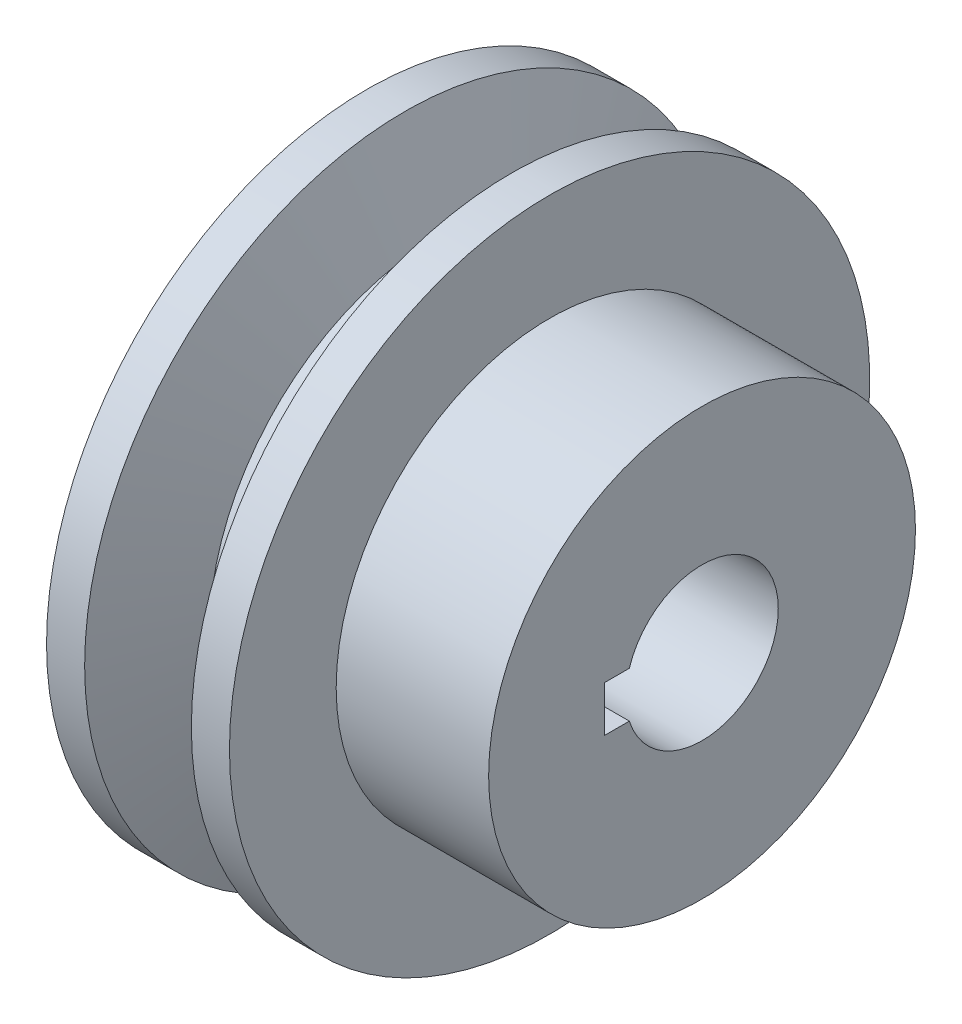
ISO-10303-21;
HEADER;
FILE_DESCRIPTION(('STEP AP214'),'2;1');
FILE_NAME('part.step','',(''),(''),'','','');
FILE_SCHEMA(('AUTOMOTIVE_DESIGN { 1 0 10303 214 1 1 1 1 }'));
ENDSEC;
DATA;
#1=APPLICATION_CONTEXT('core data for automotive mechanical design processes');
#2=APPLICATION_PROTOCOL_DEFINITION('international standard','automotive_design',2000,#1);
#3=PRODUCT_CONTEXT('',#1,'mechanical');
#4=PRODUCT('Part','Part','',(#3));
#5=PRODUCT_RELATED_PRODUCT_CATEGORY('part','',(#4));
#6=PRODUCT_DEFINITION_FORMATION('','',#4);
#7=PRODUCT_DEFINITION_CONTEXT('part definition',#1,'design');
#8=PRODUCT_DEFINITION('design','',#6,#7);
#9=PRODUCT_DEFINITION_SHAPE('','',#8);
#10=(LENGTH_UNIT() NAMED_UNIT(*) SI_UNIT(.MILLI.,.METRE.));
#11=(NAMED_UNIT(*) PLANE_ANGLE_UNIT() SI_UNIT($,.RADIAN.));
#12=(NAMED_UNIT(*) SI_UNIT($,.STERADIAN.) SOLID_ANGLE_UNIT());
#13=UNCERTAINTY_MEASURE_WITH_UNIT(LENGTH_MEASURE(1.E-05),#10,'distance_accuracy_value','');
#14=(GEOMETRIC_REPRESENTATION_CONTEXT(3) GLOBAL_UNCERTAINTY_ASSIGNED_CONTEXT((#13)) GLOBAL_UNIT_ASSIGNED_CONTEXT((#10,
#11,#12)) REPRESENTATION_CONTEXT('',''));
#15=CARTESIAN_POINT('',(0.,0.,0.));
#16=DIRECTION('',(0.,0.,1.));
#17=DIRECTION('',(1.,0.,0.));
#18=AXIS2_PLACEMENT_3D('',#15,#16,#17);
#19=CARTESIAN_POINT('',(0.,0.,0.));
#20=DIRECTION('',(1.,0.,0.));
#21=DIRECTION('',(0.,0.,-1.));
#22=AXIS2_PLACEMENT_3D('',#19,#20,#21);
#23=PLANE('',#22);
#24=DIRECTION('',(0.,0.,1.));
#25=VECTOR('',#24,1.);
#26=CARTESIAN_POINT('',(0.,-1.5,6.4));
#27=LINE('',#26,#25);
#28=CARTESIAN_POINT('',(0.,-1.5,4.76969600708473));
#29=VERTEX_POINT('',#28);
#30=CARTESIAN_POINT('',(0.,-1.5,6.4));
#31=VERTEX_POINT('',#30);
#32=EDGE_CURVE('E99',#29,#31,#27,.T.);
#33=ORIENTED_EDGE('',*,*,#32,.F.);
#34=CARTESIAN_POINT('',(0.,0.,0.));
#35=DIRECTION('',(-1.,0.,0.));
#36=DIRECTION('',(0.,0.,1.));
#37=AXIS2_PLACEMENT_3D('',#34,#35,#36);
#38=CIRCLE('',#37,5.);
#39=CARTESIAN_POINT('',(0.,1.5,4.76969600708473));
#40=VERTEX_POINT('',#39);
#41=EDGE_CURVE('E46',#40,#29,#38,.T.);
#42=ORIENTED_EDGE('',*,*,#41,.F.);
#43=DIRECTION('',(0.,0.,-1.));
#44=VECTOR('',#43,1.);
#45=CARTESIAN_POINT('',(0.,1.5,4.76969600708473));
#46=LINE('',#45,#44);
#47=CARTESIAN_POINT('',(0.,1.5,6.4));
#48=VERTEX_POINT('',#47);
#49=EDGE_CURVE('E90',#48,#40,#46,.T.);
#50=ORIENTED_EDGE('',*,*,#49,.F.);
#51=DIRECTION('',(0.,1.,0.));
#52=VECTOR('',#51,1.);
#53=CARTESIAN_POINT('',(0.,1.5,6.4));
#54=LINE('',#53,#52);
#55=EDGE_CURVE('E93',#31,#48,#54,.T.);
#56=ORIENTED_EDGE('',*,*,#55,.F.);
#57=EDGE_LOOP('',(#33,#42,#50,#56));
#58=FACE_BOUND('',#57,.T.);
#59=CARTESIAN_POINT('',(0.,0.,0.));
#60=DIRECTION('',(-1.,0.,0.));
#61=DIRECTION('',(0.,0.,1.));
#62=AXIS2_PLACEMENT_3D('',#59,#60,#61);
#63=CIRCLE('',#62,21.);
#64=CARTESIAN_POINT('',(0.,0.,21.));
#65=VERTEX_POINT('',#64);
#66=EDGE_CURVE('E11',#65,#65,#63,.T.);
#67=ORIENTED_EDGE('',*,*,#66,.T.);
#68=EDGE_LOOP('',(#67));
#69=FACE_BOUND('',#68,.T.);
#70=ADVANCED_FACE('F32',(#58,#69),#23,.F.);
#71=CARTESIAN_POINT('',(0.,0.,0.));
#72=DIRECTION('',(-1.,0.,0.));
#73=DIRECTION('',(0.,0.,1.));
#74=AXIS2_PLACEMENT_3D('',#71,#72,#73);
#75=CYLINDRICAL_SURFACE('',#74,21.);
#76=ORIENTED_EDGE('',*,*,#66,.F.);
#77=EDGE_LOOP('',(#76));
#78=FACE_BOUND('',#77,.T.);
#79=CARTESIAN_POINT('',(2.5,0.,0.));
#80=DIRECTION('',(-1.,0.,0.));
#81=DIRECTION('',(0.,0.,1.));
#82=AXIS2_PLACEMENT_3D('',#79,#80,#81);
#83=CIRCLE('',#82,21.);
#84=CARTESIAN_POINT('',(2.5,0.,21.));
#85=VERTEX_POINT('',#84);
#86=EDGE_CURVE('E39',#85,#85,#83,.T.);
#87=ORIENTED_EDGE('',*,*,#86,.T.);
#88=EDGE_LOOP('',(#87));
#89=FACE_BOUND('',#88,.T.);
#90=ADVANCED_FACE('F128',(#78,#89),#75,.T.);
#91=CARTESIAN_POINT('',(4.68382140559719,0.,0.));
#92=DIRECTION('',(-1.,0.,0.));
#93=DIRECTION('',(0.,0.,1.));
#94=AXIS2_PLACEMENT_3D('',#91,#92,#93);
#95=CONICAL_SURFACE('',#94,15.,1.22173047639603);
#96=ORIENTED_EDGE('',*,*,#86,.F.);
#97=EDGE_LOOP('',(#96));
#98=FACE_BOUND('',#97,.T.);
#99=CARTESIAN_POINT('',(4.68382140559719,0.,0.));
#100=DIRECTION('',(-1.,0.,0.));
#101=DIRECTION('',(0.,0.,1.));
#102=AXIS2_PLACEMENT_3D('',#99,#100,#101);
#103=CIRCLE('',#102,15.);
#104=CARTESIAN_POINT('',(4.68382140559719,0.,15.));
#105=VERTEX_POINT('',#104);
#106=EDGE_CURVE('E123',#105,#105,#103,.T.);
#107=ORIENTED_EDGE('',*,*,#106,.T.);
#108=EDGE_LOOP('',(#107));
#109=FACE_BOUND('',#108,.T.);
#110=ADVANCED_FACE('F130',(#98,#109),#95,.T.);
#111=CARTESIAN_POINT('',(0.,0.,0.));
#112=DIRECTION('',(-1.,0.,0.));
#113=DIRECTION('',(0.,0.,1.));
#114=AXIS2_PLACEMENT_3D('',#111,#112,#113);
#115=CYLINDRICAL_SURFACE('',#114,15.);
#116=ORIENTED_EDGE('',*,*,#106,.F.);
#117=EDGE_LOOP('',(#116));
#118=FACE_BOUND('',#117,.T.);
#119=CARTESIAN_POINT('',(7.31617859440281,0.,0.));
#120=DIRECTION('',(-1.,0.,0.));
#121=DIRECTION('',(0.,0.,1.));
#122=AXIS2_PLACEMENT_3D('',#119,#120,#121);
#123=CIRCLE('',#122,15.);
#124=CARTESIAN_POINT('',(7.31617859440281,0.,15.));
#125=VERTEX_POINT('',#124);
#126=EDGE_CURVE('E120',#125,#125,#123,.T.);
#127=ORIENTED_EDGE('',*,*,#126,.T.);
#128=EDGE_LOOP('',(#127));
#129=FACE_BOUND('',#128,.T.);
#130=ADVANCED_FACE('F133',(#118,#129),#115,.T.);
#131=CARTESIAN_POINT('',(9.5,0.,0.));
#132=DIRECTION('',(1.,0.,0.));
#133=DIRECTION('',(0.,0.,-1.));
#134=AXIS2_PLACEMENT_3D('',#131,#132,#133);
#135=CONICAL_SURFACE('',#134,21.,1.22173047639603);
#136=ORIENTED_EDGE('',*,*,#126,.F.);
#137=EDGE_LOOP('',(#136));
#138=FACE_BOUND('',#137,.T.);
#139=CARTESIAN_POINT('',(9.5,0.,0.));
#140=DIRECTION('',(-1.,0.,0.));
#141=DIRECTION('',(0.,0.,1.));
#142=AXIS2_PLACEMENT_3D('',#139,#140,#141);
#143=CIRCLE('',#142,21.);
#144=CARTESIAN_POINT('',(9.5,0.,21.));
#145=VERTEX_POINT('',#144);
#146=EDGE_CURVE('E117',#145,#145,#143,.T.);
#147=ORIENTED_EDGE('',*,*,#146,.T.);
#148=EDGE_LOOP('',(#147));
#149=FACE_BOUND('',#148,.T.);
#150=ADVANCED_FACE('F139',(#138,#149),#135,.T.);
#151=CARTESIAN_POINT('',(0.,0.,0.));
#152=DIRECTION('',(-1.,0.,0.));
#153=DIRECTION('',(0.,0.,1.));
#154=AXIS2_PLACEMENT_3D('',#151,#152,#153);
#155=CYLINDRICAL_SURFACE('',#154,21.);
#156=ORIENTED_EDGE('',*,*,#146,.F.);
#157=EDGE_LOOP('',(#156));
#158=FACE_BOUND('',#157,.T.);
#159=CARTESIAN_POINT('',(12.,0.,0.));
#160=DIRECTION('',(-1.,0.,0.));
#161=DIRECTION('',(0.,0.,1.));
#162=AXIS2_PLACEMENT_3D('',#159,#160,#161);
#163=CIRCLE('',#162,21.);
#164=CARTESIAN_POINT('',(12.,0.,21.));
#165=VERTEX_POINT('',#164);
#166=EDGE_CURVE('E114',#165,#165,#163,.T.);
#167=ORIENTED_EDGE('',*,*,#166,.T.);
#168=EDGE_LOOP('',(#167));
#169=FACE_BOUND('',#168,.T.);
#170=ADVANCED_FACE('F145',(#158,#169),#155,.T.);
#171=CARTESIAN_POINT('',(12.,21.,0.));
#172=DIRECTION('',(-1.,0.,0.));
#173=DIRECTION('',(0.,0.,1.));
#174=AXIS2_PLACEMENT_3D('',#171,#172,#173);
#175=PLANE('',#174);
#176=ORIENTED_EDGE('',*,*,#166,.F.);
#177=EDGE_LOOP('',(#176));
#178=FACE_BOUND('',#177,.T.);
#179=CARTESIAN_POINT('',(12.,0.,0.));
#180=DIRECTION('',(-1.,0.,0.));
#181=DIRECTION('',(0.,0.,1.));
#182=AXIS2_PLACEMENT_3D('',#179,#180,#181);
#183=CIRCLE('',#182,14.);
#184=CARTESIAN_POINT('',(12.,0.,14.));
#185=VERTEX_POINT('',#184);
#186=EDGE_CURVE('E111',#185,#185,#183,.T.);
#187=ORIENTED_EDGE('',*,*,#186,.T.);
#188=EDGE_LOOP('',(#187));
#189=FACE_BOUND('',#188,.T.);
#190=ADVANCED_FACE('F151',(#178,#189),#175,.F.);
#191=CARTESIAN_POINT('',(0.,0.,0.));
#192=DIRECTION('',(-1.,0.,0.));
#193=DIRECTION('',(0.,0.,1.));
#194=AXIS2_PLACEMENT_3D('',#191,#192,#193);
#195=CYLINDRICAL_SURFACE('',#194,14.);
#196=ORIENTED_EDGE('',*,*,#186,.F.);
#197=EDGE_LOOP('',(#196));
#198=FACE_BOUND('',#197,.T.);
#199=CARTESIAN_POINT('',(22.,0.,0.));
#200=DIRECTION('',(-1.,0.,0.));
#201=DIRECTION('',(0.,0.,1.));
#202=AXIS2_PLACEMENT_3D('',#199,#200,#201);
#203=CIRCLE('',#202,14.);
#204=CARTESIAN_POINT('',(22.,0.,14.));
#205=VERTEX_POINT('',#204);
#206=EDGE_CURVE('E105',#205,#205,#203,.T.);
#207=ORIENTED_EDGE('',*,*,#206,.T.);
#208=EDGE_LOOP('',(#207));
#209=FACE_BOUND('',#208,.T.);
#210=ADVANCED_FACE('F157',(#198,#209),#195,.T.);
#211=CARTESIAN_POINT('',(22.,14.,0.));
#212=DIRECTION('',(-1.,0.,0.));
#213=DIRECTION('',(0.,0.,1.));
#214=AXIS2_PLACEMENT_3D('',#211,#212,#213);
#215=PLANE('',#214);
#216=DIRECTION('',(0.,0.,-1.));
#217=VECTOR('',#216,1.);
#218=CARTESIAN_POINT('',(22.,1.5,4.76969600708473));
#219=LINE('',#218,#217);
#220=CARTESIAN_POINT('',(22.,1.5,6.4));
#221=VERTEX_POINT('',#220);
#222=CARTESIAN_POINT('',(22.,1.5,4.76969600708473));
#223=VERTEX_POINT('',#222);
#224=EDGE_CURVE('E80',#221,#223,#219,.T.);
#225=ORIENTED_EDGE('',*,*,#224,.T.);
#226=CARTESIAN_POINT('',(22.,0.,0.));
#227=DIRECTION('',(-1.,0.,0.));
#228=DIRECTION('',(0.,0.,1.));
#229=AXIS2_PLACEMENT_3D('',#226,#227,#228);
#230=CIRCLE('',#229,5.);
#231=CARTESIAN_POINT('',(22.,-1.5,4.76969600708473));
#232=VERTEX_POINT('',#231);
#233=EDGE_CURVE('E74',#223,#232,#230,.T.);
#234=ORIENTED_EDGE('',*,*,#233,.T.);
#235=DIRECTION('',(0.,0.,1.));
#236=VECTOR('',#235,1.);
#237=CARTESIAN_POINT('',(22.,-1.5,6.4));
#238=LINE('',#237,#236);
#239=CARTESIAN_POINT('',(22.,-1.5,6.4));
#240=VERTEX_POINT('',#239);
#241=EDGE_CURVE('E83',#232,#240,#238,.T.);
#242=ORIENTED_EDGE('',*,*,#241,.T.);
#243=DIRECTION('',(0.,1.,0.));
#244=VECTOR('',#243,1.);
#245=CARTESIAN_POINT('',(22.,1.5,6.4));
#246=LINE('',#245,#244);
#247=EDGE_CURVE('E54',#240,#221,#246,.T.);
#248=ORIENTED_EDGE('',*,*,#247,.T.);
#249=EDGE_LOOP('',(#225,#234,#242,#248));
#250=FACE_BOUND('',#249,.T.);
#251=ORIENTED_EDGE('',*,*,#206,.F.);
#252=EDGE_LOOP('',(#251));
#253=FACE_BOUND('',#252,.T.);
#254=ADVANCED_FACE('F87',(#250,#253),#215,.F.);
#255=CARTESIAN_POINT('',(22.,0.,0.));
#256=DIRECTION('',(-1.,0.,0.));
#257=DIRECTION('',(0.,0.,1.));
#258=AXIS2_PLACEMENT_3D('',#255,#256,#257);
#259=CYLINDRICAL_SURFACE('',#258,5.);
#260=ORIENTED_EDGE('',*,*,#41,.T.);
#261=DIRECTION('',(-1.,0.,0.));
#262=VECTOR('',#261,1.);
#263=CARTESIAN_POINT('',(22.,-1.5,4.76969600708473));
#264=LINE('',#263,#262);
#265=EDGE_CURVE('E70',#232,#29,#264,.T.);
#266=ORIENTED_EDGE('',*,*,#265,.F.);
#267=ORIENTED_EDGE('',*,*,#233,.F.);
#268=DIRECTION('',(-1.,0.,0.));
#269=VECTOR('',#268,1.);
#270=CARTESIAN_POINT('',(22.,1.5,4.76969600708473));
#271=LINE('',#270,#269);
#272=EDGE_CURVE('E103',#223,#40,#271,.T.);
#273=ORIENTED_EDGE('',*,*,#272,.T.);
#274=EDGE_LOOP('',(#260,#266,#267,#273));
#275=FACE_BOUND('',#274,.T.);
#276=ADVANCED_FACE('F72',(#275),#259,.F.);
#277=CARTESIAN_POINT('',(22.,1.5,4.76969600708473));
#278=DIRECTION('',(0.,1.,0.));
#279=DIRECTION('',(0.,0.,1.));
#280=AXIS2_PLACEMENT_3D('',#277,#278,#279);
#281=PLANE('',#280);
#282=ORIENTED_EDGE('',*,*,#49,.T.);
#283=ORIENTED_EDGE('',*,*,#272,.F.);
#284=ORIENTED_EDGE('',*,*,#224,.F.);
#285=DIRECTION('',(-1.,0.,0.));
#286=VECTOR('',#285,1.);
#287=CARTESIAN_POINT('',(22.,1.5,6.4));
#288=LINE('',#287,#286);
#289=EDGE_CURVE('E106',#221,#48,#288,.T.);
#290=ORIENTED_EDGE('',*,*,#289,.T.);
#291=EDGE_LOOP('',(#282,#283,#284,#290));
#292=FACE_BOUND('',#291,.T.);
#293=ADVANCED_FACE('F170',(#292),#281,.F.);
#294=CARTESIAN_POINT('',(22.,1.5,6.4));
#295=DIRECTION('',(0.,0.,1.));
#296=DIRECTION('',(1.,0.,0.));
#297=AXIS2_PLACEMENT_3D('',#294,#295,#296);
#298=PLANE('',#297);
#299=ORIENTED_EDGE('',*,*,#55,.T.);
#300=ORIENTED_EDGE('',*,*,#289,.F.);
#301=ORIENTED_EDGE('',*,*,#247,.F.);
#302=DIRECTION('',(-1.,0.,0.));
#303=VECTOR('',#302,1.);
#304=CARTESIAN_POINT('',(22.,-1.5,6.4));
#305=LINE('',#304,#303);
#306=EDGE_CURVE('E79',#240,#31,#305,.T.);
#307=ORIENTED_EDGE('',*,*,#306,.T.);
#308=EDGE_LOOP('',(#299,#300,#301,#307));
#309=FACE_BOUND('',#308,.T.);
#310=ADVANCED_FACE('F182',(#309),#298,.F.);
#311=CARTESIAN_POINT('',(22.,-1.5,6.4));
#312=DIRECTION('',(0.,-1.,0.));
#313=DIRECTION('',(0.,0.,-1.));
#314=AXIS2_PLACEMENT_3D('',#311,#312,#313);
#315=PLANE('',#314);
#316=ORIENTED_EDGE('',*,*,#32,.T.);
#317=ORIENTED_EDGE('',*,*,#306,.F.);
#318=ORIENTED_EDGE('',*,*,#241,.F.);
#319=ORIENTED_EDGE('',*,*,#265,.T.);
#320=EDGE_LOOP('',(#316,#317,#318,#319));
#321=FACE_BOUND('',#320,.T.);
#322=ADVANCED_FACE('F84',(#321),#315,.F.);
#323=CLOSED_SHELL('',(#70,#90,#110,#130,#150,#170,#190,#210,#254,#276,#293,#310,#322));
#324=MANIFOLD_SOLID_BREP('B2',#323);
#325=ADVANCED_BREP_SHAPE_REPRESENTATION('',(#18,#324),#14);
#326=SHAPE_DEFINITION_REPRESENTATION(#9,#325);
ENDSEC;
END-ISO-10303-21;
